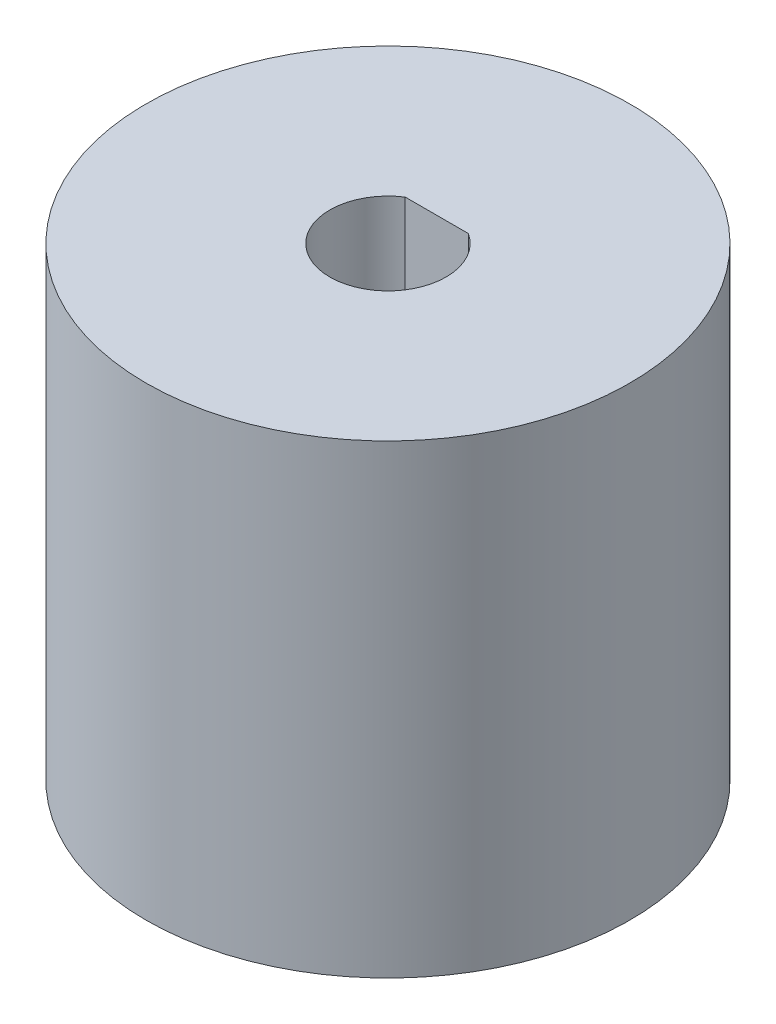
ISO-10303-21;
HEADER;
FILE_DESCRIPTION(('STEP AP214'),'2;1');
FILE_NAME('part.step','',(''),(''),'','','');
FILE_SCHEMA(('AUTOMOTIVE_DESIGN { 1 0 10303 214 1 1 1 1 }'));
ENDSEC;
DATA;
#1=APPLICATION_CONTEXT('core data for automotive mechanical design processes');
#2=APPLICATION_PROTOCOL_DEFINITION('international standard','automotive_design',2000,#1);
#3=PRODUCT_CONTEXT('',#1,'mechanical');
#4=PRODUCT('Part','Part','',(#3));
#5=PRODUCT_RELATED_PRODUCT_CATEGORY('part','',(#4));
#6=PRODUCT_DEFINITION_FORMATION('','',#4);
#7=PRODUCT_DEFINITION_CONTEXT('part definition',#1,'design');
#8=PRODUCT_DEFINITION('design','',#6,#7);
#9=PRODUCT_DEFINITION_SHAPE('','',#8);
#10=(LENGTH_UNIT() NAMED_UNIT(*) SI_UNIT(.MILLI.,.METRE.));
#11=(NAMED_UNIT(*) PLANE_ANGLE_UNIT() SI_UNIT($,.RADIAN.));
#12=(NAMED_UNIT(*) SI_UNIT($,.STERADIAN.) SOLID_ANGLE_UNIT());
#13=UNCERTAINTY_MEASURE_WITH_UNIT(LENGTH_MEASURE(1.E-05),#10,'distance_accuracy_value','');
#14=(GEOMETRIC_REPRESENTATION_CONTEXT(3) GLOBAL_UNCERTAINTY_ASSIGNED_CONTEXT((#13)) GLOBAL_UNIT_ASSIGNED_CONTEXT((#10,
#11,#12)) REPRESENTATION_CONTEXT('',''));
#15=CARTESIAN_POINT('',(0.,0.,0.));
#16=DIRECTION('',(0.,0.,1.));
#17=DIRECTION('',(1.,0.,0.));
#18=AXIS2_PLACEMENT_3D('',#15,#16,#17);
#19=CARTESIAN_POINT('',(0.,0.,0.));
#20=DIRECTION('',(0.,1.,0.));
#21=DIRECTION('',(0.,0.,1.));
#22=AXIS2_PLACEMENT_3D('',#19,#20,#21);
#23=PLANE('',#22);
#24=CARTESIAN_POINT('',(0.,0.,0.));
#25=DIRECTION('',(0.,1.,0.));
#26=DIRECTION('',(0.,0.,1.));
#27=AXIS2_PLACEMENT_3D('',#24,#25,#26);
#28=CIRCLE('',#27,13.208);
#29=CARTESIAN_POINT('',(0.,0.,13.208));
#30=VERTEX_POINT('',#29);
#31=EDGE_CURVE('E37',#30,#30,#28,.T.);
#32=ORIENTED_EDGE('',*,*,#31,.F.);
#33=EDGE_LOOP('',(#32));
#34=FACE_BOUND('',#33,.T.);
#35=CARTESIAN_POINT('',(0.,0.,0.));
#36=DIRECTION('',(0.,1.,0.));
#37=DIRECTION('',(0.,0.,1.));
#38=AXIS2_PLACEMENT_3D('',#35,#36,#37);
#39=CIRCLE('',#38,3.175);
#40=CARTESIAN_POINT('',(0.,0.,3.175));
#41=VERTEX_POINT('',#40);
#42=EDGE_CURVE('E62',#41,#41,#39,.T.);
#43=ORIENTED_EDGE('',*,*,#42,.T.);
#44=EDGE_LOOP('',(#43));
#45=FACE_BOUND('',#44,.T.);
#46=ADVANCED_FACE('F33',(#34,#45),#23,.F.);
#47=CARTESIAN_POINT('',(0.,25.4,0.));
#48=DIRECTION('',(0.,1.,0.));
#49=DIRECTION('',(0.,0.,1.));
#50=AXIS2_PLACEMENT_3D('',#47,#48,#49);
#51=PLANE('',#50);
#52=CARTESIAN_POINT('',(0.,25.4,0.));
#53=DIRECTION('',(0.,1.,0.));
#54=DIRECTION('',(0.,0.,1.));
#55=AXIS2_PLACEMENT_3D('',#52,#53,#54);
#56=CIRCLE('',#55,13.208);
#57=CARTESIAN_POINT('',(0.,25.4,13.208));
#58=VERTEX_POINT('',#57);
#59=EDGE_CURVE('E11',#58,#58,#56,.T.);
#60=ORIENTED_EDGE('',*,*,#59,.T.);
#61=EDGE_LOOP('',(#60));
#62=FACE_BOUND('',#61,.T.);
#63=CARTESIAN_POINT('',(0.,25.4,0.));
#64=DIRECTION('',(0.,1.,0.));
#65=DIRECTION('',(0.,0.,1.));
#66=AXIS2_PLACEMENT_3D('',#63,#64,#65);
#67=CIRCLE('',#66,3.175);
#68=CARTESIAN_POINT('',(-1.72271181571381,25.4,-2.667));
#69=VERTEX_POINT('',#68);
#70=CARTESIAN_POINT('',(1.72271181571381,25.4,-2.667));
#71=VERTEX_POINT('',#70);
#72=EDGE_CURVE('E72',#69,#71,#67,.T.);
#73=ORIENTED_EDGE('',*,*,#72,.F.);
#74=DIRECTION('',(-1.,0.,0.));
#75=VECTOR('',#74,1.);
#76=CARTESIAN_POINT('',(0.,25.4,-2.667));
#77=LINE('',#76,#75);
#78=EDGE_CURVE('E75',#71,#69,#77,.T.);
#79=ORIENTED_EDGE('',*,*,#78,.F.);
#80=EDGE_LOOP('',(#73,#79));
#81=FACE_BOUND('',#80,.T.);
#82=ADVANCED_FACE('F81',(#62,#81),#51,.T.);
#83=CARTESIAN_POINT('',(0.,25.4,0.));
#84=DIRECTION('',(0.,-1.,0.));
#85=DIRECTION('',(0.,0.,-1.));
#86=AXIS2_PLACEMENT_3D('',#83,#84,#85);
#87=CYLINDRICAL_SURFACE('',#86,13.208);
#88=ORIENTED_EDGE('',*,*,#59,.F.);
#89=EDGE_LOOP('',(#88));
#90=FACE_BOUND('',#89,.T.);
#91=ORIENTED_EDGE('',*,*,#31,.T.);
#92=EDGE_LOOP('',(#91));
#93=FACE_BOUND('',#92,.T.);
#94=ADVANCED_FACE('F35',(#90,#93),#87,.T.);
#95=CARTESIAN_POINT('',(0.,25.4,-2.667));
#96=DIRECTION('',(0.,0.,1.));
#97=DIRECTION('',(1.,0.,0.));
#98=AXIS2_PLACEMENT_3D('',#95,#96,#97);
#99=PLANE('',#98);
#100=DIRECTION('',(1.,0.,0.));
#101=VECTOR('',#100,1.);
#102=CARTESIAN_POINT('',(0.,5.588,-2.667));
#103=LINE('',#102,#101);
#104=CARTESIAN_POINT('',(-1.72271181571381,5.588,-2.667));
#105=VERTEX_POINT('',#104);
#106=CARTESIAN_POINT('',(1.72271181571381,5.588,-2.667));
#107=VERTEX_POINT('',#106);
#108=EDGE_CURVE('E47',#105,#107,#103,.T.);
#109=ORIENTED_EDGE('',*,*,#108,.T.);
#110=DIRECTION('',(0.,-1.,0.));
#111=VECTOR('',#110,1.);
#112=CARTESIAN_POINT('',(1.72271181571381,25.4,-2.667));
#113=LINE('',#112,#111);
#114=EDGE_CURVE('E67',#71,#107,#113,.T.);
#115=ORIENTED_EDGE('',*,*,#114,.F.);
#116=ORIENTED_EDGE('',*,*,#78,.T.);
#117=DIRECTION('',(0.,-1.,0.));
#118=VECTOR('',#117,1.);
#119=CARTESIAN_POINT('',(-1.72271181571381,25.4,-2.667));
#120=LINE('',#119,#118);
#121=EDGE_CURVE('E54',#69,#105,#120,.T.);
#122=ORIENTED_EDGE('',*,*,#121,.T.);
#123=EDGE_LOOP('',(#109,#115,#116,#122));
#124=FACE_BOUND('',#123,.T.);
#125=ADVANCED_FACE('F66',(#124),#99,.T.);
#126=CARTESIAN_POINT('',(0.,25.4,0.));
#127=DIRECTION('',(0.,-1.,0.));
#128=DIRECTION('',(0.,0.,-1.));
#129=AXIS2_PLACEMENT_3D('',#126,#127,#128);
#130=CYLINDRICAL_SURFACE('',#129,3.175);
#131=ORIENTED_EDGE('',*,*,#42,.F.);
#132=EDGE_LOOP('',(#131));
#133=FACE_BOUND('',#132,.T.);
#134=ORIENTED_EDGE('',*,*,#114,.T.);
#135=CARTESIAN_POINT('',(0.,5.588,0.));
#136=DIRECTION('',(0.,1.,0.));
#137=DIRECTION('',(0.,0.,1.));
#138=AXIS2_PLACEMENT_3D('',#135,#136,#137);
#139=CIRCLE('',#138,3.175);
#140=EDGE_CURVE('E59',#107,#105,#139,.T.);
#141=ORIENTED_EDGE('',*,*,#140,.T.);
#142=ORIENTED_EDGE('',*,*,#121,.F.);
#143=ORIENTED_EDGE('',*,*,#72,.T.);
#144=EDGE_LOOP('',(#134,#141,#142,#143));
#145=FACE_BOUND('',#144,.T.);
#146=ADVANCED_FACE('F70',(#133,#145),#130,.F.);
#147=CARTESIAN_POINT('',(0.,5.588,0.));
#148=DIRECTION('',(0.,1.,0.));
#149=DIRECTION('',(0.,0.,1.));
#150=AXIS2_PLACEMENT_3D('',#147,#148,#149);
#151=PLANE('',#150);
#152=ORIENTED_EDGE('',*,*,#108,.F.);
#153=ORIENTED_EDGE('',*,*,#140,.F.);
#154=EDGE_LOOP('',(#152,#153));
#155=FACE_BOUND('',#154,.T.);
#156=ADVANCED_FACE('F60',(#155),#151,.F.);
#157=CLOSED_SHELL('',(#46,#82,#94,#125,#146,#156));
#158=MANIFOLD_SOLID_BREP('B2',#157);
#159=ADVANCED_BREP_SHAPE_REPRESENTATION('',(#18,#158),#14);
#160=SHAPE_DEFINITION_REPRESENTATION(#9,#159);
ENDSEC;
END-ISO-10303-21;
